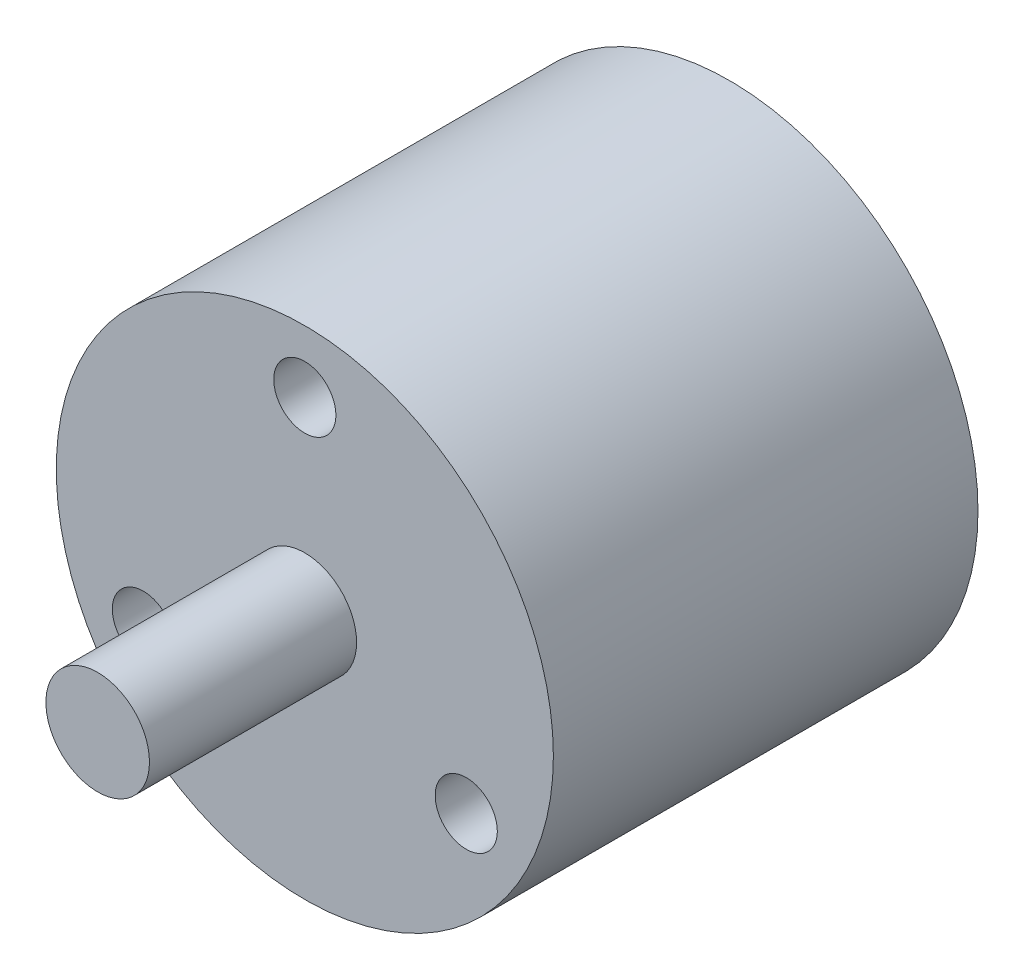
ISO-10303-21;
HEADER;
FILE_DESCRIPTION(('STEP AP214'),'2;1');
FILE_NAME('part.step','',(''),(''),'','','');
FILE_SCHEMA(('AUTOMOTIVE_DESIGN { 1 0 10303 214 1 1 1 1 }'));
ENDSEC;
DATA;
#1=APPLICATION_CONTEXT('core data for automotive mechanical design processes');
#2=APPLICATION_PROTOCOL_DEFINITION('international standard','automotive_design',2000,#1);
#3=PRODUCT_CONTEXT('',#1,'mechanical');
#4=PRODUCT('Part','Part','',(#3));
#5=PRODUCT_RELATED_PRODUCT_CATEGORY('part','',(#4));
#6=PRODUCT_DEFINITION_FORMATION('','',#4);
#7=PRODUCT_DEFINITION_CONTEXT('part definition',#1,'design');
#8=PRODUCT_DEFINITION('design','',#6,#7);
#9=PRODUCT_DEFINITION_SHAPE('','',#8);
#10=(LENGTH_UNIT() NAMED_UNIT(*) SI_UNIT(.MILLI.,.METRE.));
#11=(NAMED_UNIT(*) PLANE_ANGLE_UNIT() SI_UNIT($,.RADIAN.));
#12=(NAMED_UNIT(*) SI_UNIT($,.STERADIAN.) SOLID_ANGLE_UNIT());
#13=UNCERTAINTY_MEASURE_WITH_UNIT(LENGTH_MEASURE(1.E-05),#10,'distance_accuracy_value','');
#14=(GEOMETRIC_REPRESENTATION_CONTEXT(3) GLOBAL_UNCERTAINTY_ASSIGNED_CONTEXT((#13)) GLOBAL_UNIT_ASSIGNED_CONTEXT((#10,
#11,#12)) REPRESENTATION_CONTEXT('',''));
#15=CARTESIAN_POINT('',(0.,0.,0.));
#16=DIRECTION('',(0.,0.,1.));
#17=DIRECTION('',(1.,0.,0.));
#18=AXIS2_PLACEMENT_3D('',#15,#16,#17);
#19=CARTESIAN_POINT('',(0.,0.,20.5));
#20=DIRECTION('',(0.,0.,-1.));
#21=DIRECTION('',(-1.,0.,0.));
#22=AXIS2_PLACEMENT_3D('',#19,#20,#21);
#23=CYLINDRICAL_SURFACE('',#22,12.);
#24=CARTESIAN_POINT('',(0.,0.,20.5));
#25=DIRECTION('',(0.,0.,1.));
#26=DIRECTION('',(1.,0.,0.));
#27=AXIS2_PLACEMENT_3D('',#24,#25,#26);
#28=CIRCLE('',#27,12.);
#29=CARTESIAN_POINT('',(12.,0.,20.5));
#30=VERTEX_POINT('',#29);
#31=EDGE_CURVE('E42',#30,#30,#28,.T.);
#32=ORIENTED_EDGE('',*,*,#31,.F.);
#33=EDGE_LOOP('',(#32));
#34=FACE_BOUND('',#33,.T.);
#35=CARTESIAN_POINT('',(0.,0.,0.));
#36=DIRECTION('',(0.,0.,1.));
#37=DIRECTION('',(1.,0.,0.));
#38=AXIS2_PLACEMENT_3D('',#35,#36,#37);
#39=CIRCLE('',#38,12.);
#40=CARTESIAN_POINT('',(12.,0.,0.));
#41=VERTEX_POINT('',#40);
#42=EDGE_CURVE('E38',#41,#41,#39,.T.);
#43=ORIENTED_EDGE('',*,*,#42,.T.);
#44=EDGE_LOOP('',(#43));
#45=FACE_BOUND('',#44,.T.);
#46=ADVANCED_FACE('F35',(#34,#45),#23,.T.);
#47=CARTESIAN_POINT('',(0.,0.,20.5));
#48=DIRECTION('',(0.,0.,1.));
#49=DIRECTION('',(1.,0.,0.));
#50=AXIS2_PLACEMENT_3D('',#47,#48,#49);
#51=PLANE('',#50);
#52=CARTESIAN_POINT('',(-7.79422863405991,-4.50000000000006,20.5));
#53=DIRECTION('',(0.,0.,1.));
#54=DIRECTION('',(1.,0.,0.));
#55=AXIS2_PLACEMENT_3D('',#52,#53,#54);
#56=CIRCLE('',#55,1.5);
#57=CARTESIAN_POINT('',(-6.29422863405991,-4.50000000000006,20.5));
#58=VERTEX_POINT('',#57);
#59=EDGE_CURVE('E61',#58,#58,#56,.T.);
#60=ORIENTED_EDGE('',*,*,#59,.F.);
#61=EDGE_LOOP('',(#60));
#62=FACE_BOUND('',#61,.T.);
#63=CARTESIAN_POINT('',(7.79422863405994,-4.50000000000001,20.5));
#64=DIRECTION('',(0.,0.,1.));
#65=DIRECTION('',(1.,0.,0.));
#66=AXIS2_PLACEMENT_3D('',#63,#64,#65);
#67=CIRCLE('',#66,1.5);
#68=CARTESIAN_POINT('',(9.29422863405994,-4.50000000000001,20.5));
#69=VERTEX_POINT('',#68);
#70=EDGE_CURVE('E55',#69,#69,#67,.T.);
#71=ORIENTED_EDGE('',*,*,#70,.F.);
#72=EDGE_LOOP('',(#71));
#73=FACE_BOUND('',#72,.T.);
#74=CARTESIAN_POINT('',(0.,9.,20.5));
#75=DIRECTION('',(0.,0.,1.));
#76=DIRECTION('',(1.,0.,0.));
#77=AXIS2_PLACEMENT_3D('',#74,#75,#76);
#78=CIRCLE('',#77,1.5);
#79=CARTESIAN_POINT('',(1.5,9.,20.5));
#80=VERTEX_POINT('',#79);
#81=EDGE_CURVE('E48',#80,#80,#78,.T.);
#82=ORIENTED_EDGE('',*,*,#81,.F.);
#83=EDGE_LOOP('',(#82));
#84=FACE_BOUND('',#83,.T.);
#85=CARTESIAN_POINT('',(0.,0.,20.5));
#86=DIRECTION('',(0.,0.,1.));
#87=DIRECTION('',(1.,0.,0.));
#88=AXIS2_PLACEMENT_3D('',#85,#86,#87);
#89=CIRCLE('',#88,2.5);
#90=CARTESIAN_POINT('',(2.5,0.,20.5));
#91=VERTEX_POINT('',#90);
#92=EDGE_CURVE('E10',#91,#91,#89,.T.);
#93=ORIENTED_EDGE('',*,*,#92,.F.);
#94=EDGE_LOOP('',(#93));
#95=FACE_BOUND('',#94,.T.);
#96=ORIENTED_EDGE('',*,*,#31,.T.);
#97=EDGE_LOOP('',(#96));
#98=FACE_BOUND('',#97,.T.);
#99=ADVANCED_FACE('F84',(#62,#73,#84,#95,#98),#51,.T.);
#100=CARTESIAN_POINT('',(0.,0.,0.));
#101=DIRECTION('',(0.,0.,1.));
#102=DIRECTION('',(1.,0.,0.));
#103=AXIS2_PLACEMENT_3D('',#100,#101,#102);
#104=PLANE('',#103);
#105=ORIENTED_EDGE('',*,*,#42,.F.);
#106=EDGE_LOOP('',(#105));
#107=FACE_BOUND('',#106,.T.);
#108=ADVANCED_FACE('F75',(#107),#104,.F.);
#109=CARTESIAN_POINT('',(0.,0.,22.5));
#110=DIRECTION('',(0.,0.,-1.));
#111=DIRECTION('',(-1.,0.,0.));
#112=AXIS2_PLACEMENT_3D('',#109,#110,#111);
#113=CYLINDRICAL_SURFACE('',#112,2.5);
#114=ORIENTED_EDGE('',*,*,#92,.T.);
#115=EDGE_LOOP('',(#114));
#116=FACE_BOUND('',#115,.T.);
#117=CARTESIAN_POINT('',(0.,0.,30.5));
#118=DIRECTION('',(0.,0.,1.));
#119=DIRECTION('',(1.,0.,0.));
#120=AXIS2_PLACEMENT_3D('',#117,#118,#119);
#121=CIRCLE('',#120,2.5);
#122=CARTESIAN_POINT('',(2.5,0.,30.5));
#123=VERTEX_POINT('',#122);
#124=EDGE_CURVE('E52',#123,#123,#121,.T.);
#125=ORIENTED_EDGE('',*,*,#124,.F.);
#126=EDGE_LOOP('',(#125));
#127=FACE_BOUND('',#126,.T.);
#128=ADVANCED_FACE('F72',(#116,#127),#113,.T.);
#129=CARTESIAN_POINT('',(0.,9.,17.5));
#130=DIRECTION('',(0.,0.,1.));
#131=DIRECTION('',(1.,0.,0.));
#132=AXIS2_PLACEMENT_3D('',#129,#130,#131);
#133=CYLINDRICAL_SURFACE('',#132,1.5);
#134=CARTESIAN_POINT('',(0.,9.,17.5));
#135=DIRECTION('',(0.,0.,1.));
#136=DIRECTION('',(1.,0.,0.));
#137=AXIS2_PLACEMENT_3D('',#134,#135,#136);
#138=CIRCLE('',#137,1.5);
#139=CARTESIAN_POINT('',(1.5,9.,17.5));
#140=VERTEX_POINT('',#139);
#141=EDGE_CURVE('E51',#140,#140,#138,.T.);
#142=ORIENTED_EDGE('',*,*,#141,.F.);
#143=EDGE_LOOP('',(#142));
#144=FACE_BOUND('',#143,.T.);
#145=ORIENTED_EDGE('',*,*,#81,.T.);
#146=EDGE_LOOP('',(#145));
#147=FACE_BOUND('',#146,.T.);
#148=ADVANCED_FACE('F74',(#144,#147),#133,.F.);
#149=CARTESIAN_POINT('',(0.,0.,17.5));
#150=DIRECTION('',(0.,0.,1.));
#151=DIRECTION('',(1.,0.,0.));
#152=AXIS2_PLACEMENT_3D('',#149,#150,#151);
#153=PLANE('',#152);
#154=ORIENTED_EDGE('',*,*,#141,.T.);
#155=EDGE_LOOP('',(#154));
#156=FACE_BOUND('',#155,.T.);
#157=ADVANCED_FACE('F81',(#156),#153,.T.);
#158=CARTESIAN_POINT('',(7.79422863405994,-4.50000000000001,17.5));
#159=DIRECTION('',(0.,0.,1.));
#160=DIRECTION('',(1.,0.,0.));
#161=AXIS2_PLACEMENT_3D('',#158,#159,#160);
#162=CYLINDRICAL_SURFACE('',#161,1.5);
#163=CARTESIAN_POINT('',(7.79422863405994,-4.50000000000001,17.5));
#164=DIRECTION('',(0.,0.,1.));
#165=DIRECTION('',(1.,0.,0.));
#166=AXIS2_PLACEMENT_3D('',#163,#164,#165);
#167=CIRCLE('',#166,1.5);
#168=CARTESIAN_POINT('',(9.29422863405994,-4.50000000000001,17.5));
#169=VERTEX_POINT('',#168);
#170=EDGE_CURVE('E58',#169,#169,#167,.T.);
#171=ORIENTED_EDGE('',*,*,#170,.F.);
#172=EDGE_LOOP('',(#171));
#173=FACE_BOUND('',#172,.T.);
#174=ORIENTED_EDGE('',*,*,#70,.T.);
#175=EDGE_LOOP('',(#174));
#176=FACE_BOUND('',#175,.T.);
#177=ADVANCED_FACE('F108',(#173,#176),#162,.F.);
#178=CARTESIAN_POINT('',(0.,0.,17.5));
#179=DIRECTION('',(0.,0.,1.));
#180=DIRECTION('',(1.,0.,0.));
#181=AXIS2_PLACEMENT_3D('',#178,#179,#180);
#182=PLANE('',#181);
#183=ORIENTED_EDGE('',*,*,#170,.T.);
#184=EDGE_LOOP('',(#183));
#185=FACE_BOUND('',#184,.T.);
#186=ADVANCED_FACE('F110',(#185),#182,.T.);
#187=CARTESIAN_POINT('',(-7.79422863405991,-4.50000000000006,17.5));
#188=DIRECTION('',(0.,0.,1.));
#189=DIRECTION('',(1.,0.,0.));
#190=AXIS2_PLACEMENT_3D('',#187,#188,#189);
#191=CYLINDRICAL_SURFACE('',#190,1.5);
#192=CARTESIAN_POINT('',(-7.79422863405991,-4.50000000000006,17.5));
#193=DIRECTION('',(0.,0.,1.));
#194=DIRECTION('',(1.,0.,0.));
#195=AXIS2_PLACEMENT_3D('',#192,#193,#194);
#196=CIRCLE('',#195,1.5);
#197=CARTESIAN_POINT('',(-6.29422863405991,-4.50000000000006,17.5));
#198=VERTEX_POINT('',#197);
#199=EDGE_CURVE('E64',#198,#198,#196,.T.);
#200=ORIENTED_EDGE('',*,*,#199,.F.);
#201=EDGE_LOOP('',(#200));
#202=FACE_BOUND('',#201,.T.);
#203=ORIENTED_EDGE('',*,*,#59,.T.);
#204=EDGE_LOOP('',(#203));
#205=FACE_BOUND('',#204,.T.);
#206=ADVANCED_FACE('F117',(#202,#205),#191,.F.);
#207=CARTESIAN_POINT('',(0.,0.,17.5));
#208=DIRECTION('',(0.,0.,1.));
#209=DIRECTION('',(1.,0.,0.));
#210=AXIS2_PLACEMENT_3D('',#207,#208,#209);
#211=PLANE('',#210);
#212=ORIENTED_EDGE('',*,*,#199,.T.);
#213=EDGE_LOOP('',(#212));
#214=FACE_BOUND('',#213,.T.);
#215=ADVANCED_FACE('F126',(#214),#211,.T.);
#216=CARTESIAN_POINT('',(0.,0.,30.5));
#217=DIRECTION('',(0.,0.,1.));
#218=DIRECTION('',(1.,0.,0.));
#219=AXIS2_PLACEMENT_3D('',#216,#217,#218);
#220=PLANE('',#219);
#221=ORIENTED_EDGE('',*,*,#124,.T.);
#222=EDGE_LOOP('',(#221));
#223=FACE_BOUND('',#222,.T.);
#224=ADVANCED_FACE('F70',(#223),#220,.T.);
#225=CLOSED_SHELL('',(#46,#99,#108,#128,#148,#157,#177,#186,#206,#215,#224));
#226=MANIFOLD_SOLID_BREP('B2',#225);
#227=ADVANCED_BREP_SHAPE_REPRESENTATION('',(#18,#226),#14);
#228=SHAPE_DEFINITION_REPRESENTATION(#9,#227);
ENDSEC;
END-ISO-10303-21;
